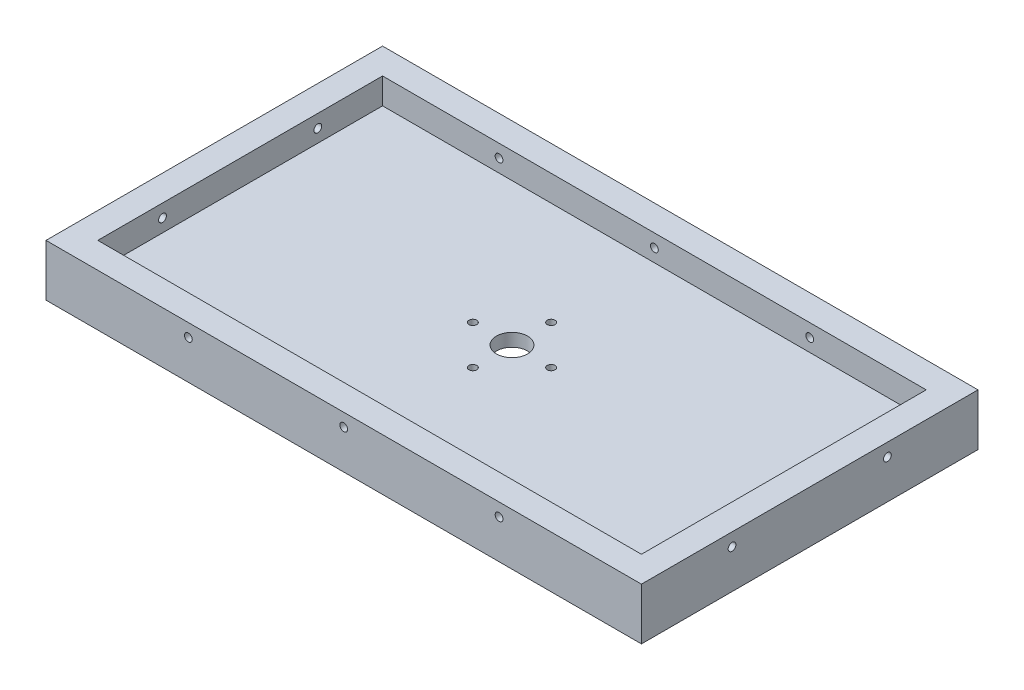
ISO-10303-21;
HEADER;
FILE_DESCRIPTION(('STEP AP214'),'2;1');
FILE_NAME('part.step','',(''),(''),'','','');
FILE_SCHEMA(('AUTOMOTIVE_DESIGN { 1 0 10303 214 1 1 1 1 }'));
ENDSEC;
DATA;
#1=APPLICATION_CONTEXT('core data for automotive mechanical design processes');
#2=APPLICATION_PROTOCOL_DEFINITION('international standard','automotive_design',2000,#1);
#3=PRODUCT_CONTEXT('',#1,'mechanical');
#4=PRODUCT('Part','Part','',(#3));
#5=PRODUCT_RELATED_PRODUCT_CATEGORY('part','',(#4));
#6=PRODUCT_DEFINITION_FORMATION('','',#4);
#7=PRODUCT_DEFINITION_CONTEXT('part definition',#1,'design');
#8=PRODUCT_DEFINITION('design','',#6,#7);
#9=PRODUCT_DEFINITION_SHAPE('','',#8);
#10=(LENGTH_UNIT() NAMED_UNIT(*) SI_UNIT(.MILLI.,.METRE.));
#11=(NAMED_UNIT(*) PLANE_ANGLE_UNIT() SI_UNIT($,.RADIAN.));
#12=(NAMED_UNIT(*) SI_UNIT($,.STERADIAN.) SOLID_ANGLE_UNIT());
#13=UNCERTAINTY_MEASURE_WITH_UNIT(LENGTH_MEASURE(1.E-05),#10,'distance_accuracy_value','');
#14=(GEOMETRIC_REPRESENTATION_CONTEXT(3) GLOBAL_UNCERTAINTY_ASSIGNED_CONTEXT((#13)) GLOBAL_UNIT_ASSIGNED_CONTEXT((#10,
#11,#12)) REPRESENTATION_CONTEXT('',''));
#15=CARTESIAN_POINT('',(0.,0.,0.));
#16=DIRECTION('',(0.,0.,1.));
#17=DIRECTION('',(1.,0.,0.));
#18=AXIS2_PLACEMENT_3D('',#15,#16,#17);
#19=CARTESIAN_POINT('',(0.,10.,0.));
#20=DIRECTION('',(0.,-1.,0.));
#21=DIRECTION('',(0.,0.,-1.));
#22=AXIS2_PLACEMENT_3D('',#19,#20,#21);
#23=PLANE('',#22);
#24=CARTESIAN_POINT('',(105.,10.,55.));
#25=DIRECTION('',(0.,-1.,0.));
#26=DIRECTION('',(0.,0.,-1.));
#27=AXIS2_PLACEMENT_3D('',#24,#25,#26);
#28=CIRCLE('',#27,6.);
#29=CARTESIAN_POINT('',(105.,10.,49.));
#30=VERTEX_POINT('',#29);
#31=EDGE_CURVE('E204',#30,#30,#28,.T.);
#32=ORIENTED_EDGE('',*,*,#31,.T.);
#33=EDGE_LOOP('',(#32));
#34=FACE_BOUND('',#33,.T.);
#35=CARTESIAN_POINT('',(120.12891571032,10.,55.));
#36=DIRECTION('',(0.,-1.,0.));
#37=DIRECTION('',(0.,0.,-1.));
#38=AXIS2_PLACEMENT_3D('',#35,#36,#37);
#39=CIRCLE('',#38,1.5);
#40=CARTESIAN_POINT('',(120.12891571032,10.,53.5));
#41=VERTEX_POINT('',#40);
#42=EDGE_CURVE('E212',#41,#41,#39,.T.);
#43=ORIENTED_EDGE('',*,*,#42,.T.);
#44=EDGE_LOOP('',(#43));
#45=FACE_BOUND('',#44,.T.);
#46=CARTESIAN_POINT('',(105.,10.,70.1289157103201));
#47=DIRECTION('',(0.,-1.,0.));
#48=DIRECTION('',(0.,0.,-1.));
#49=AXIS2_PLACEMENT_3D('',#46,#47,#48);
#50=CIRCLE('',#49,1.5);
#51=CARTESIAN_POINT('',(105.,10.,68.6289157103201));
#52=VERTEX_POINT('',#51);
#53=EDGE_CURVE('E224',#52,#52,#50,.T.);
#54=ORIENTED_EDGE('',*,*,#53,.T.);
#55=EDGE_LOOP('',(#54));
#56=FACE_BOUND('',#55,.T.);
#57=CARTESIAN_POINT('',(105.,10.,39.8710842896799));
#58=DIRECTION('',(0.,-1.,0.));
#59=DIRECTION('',(0.,0.,-1.));
#60=AXIS2_PLACEMENT_3D('',#57,#58,#59);
#61=CIRCLE('',#60,1.5);
#62=CARTESIAN_POINT('',(105.,10.,38.3710842896799));
#63=VERTEX_POINT('',#62);
#64=EDGE_CURVE('E232',#63,#63,#61,.T.);
#65=ORIENTED_EDGE('',*,*,#64,.T.);
#66=EDGE_LOOP('',(#65));
#67=FACE_BOUND('',#66,.T.);
#68=CARTESIAN_POINT('',(89.8710842896799,10.,55.));
#69=DIRECTION('',(0.,-1.,0.));
#70=DIRECTION('',(0.,0.,-1.));
#71=AXIS2_PLACEMENT_3D('',#68,#69,#70);
#72=CIRCLE('',#71,1.5);
#73=CARTESIAN_POINT('',(89.8710842896799,10.,53.5));
#74=VERTEX_POINT('',#73);
#75=EDGE_CURVE('E208',#74,#74,#72,.T.);
#76=ORIENTED_EDGE('',*,*,#75,.T.);
#77=EDGE_LOOP('',(#76));
#78=FACE_BOUND('',#77,.T.);
#79=DIRECTION('',(0.,0.,1.));
#80=VECTOR('',#79,1.);
#81=CARTESIAN_POINT('',(0.,10.,110.));
#82=LINE('',#81,#80);
#83=CARTESIAN_POINT('',(0.,10.,0.));
#84=VERTEX_POINT('',#83);
#85=CARTESIAN_POINT('',(0.,10.,110.));
#86=VERTEX_POINT('',#85);
#87=EDGE_CURVE('E112',#84,#86,#82,.T.);
#88=ORIENTED_EDGE('',*,*,#87,.T.);
#89=DIRECTION('',(1.,0.,0.));
#90=VECTOR('',#89,1.);
#91=CARTESIAN_POINT('',(210.,10.,110.));
#92=LINE('',#91,#90);
#93=CARTESIAN_POINT('',(210.,10.,110.));
#94=VERTEX_POINT('',#93);
#95=EDGE_CURVE('E65',#86,#94,#92,.T.);
#96=ORIENTED_EDGE('',*,*,#95,.T.);
#97=DIRECTION('',(0.,0.,-1.));
#98=VECTOR('',#97,1.);
#99=CARTESIAN_POINT('',(210.,10.,0.));
#100=LINE('',#99,#98);
#101=CARTESIAN_POINT('',(210.,10.,0.));
#102=VERTEX_POINT('',#101);
#103=EDGE_CURVE('E49',#94,#102,#100,.T.);
#104=ORIENTED_EDGE('',*,*,#103,.T.);
#105=DIRECTION('',(-1.,0.,0.));
#106=VECTOR('',#105,1.);
#107=CARTESIAN_POINT('',(0.,10.,0.));
#108=LINE('',#107,#106);
#109=EDGE_CURVE('E11',#102,#84,#108,.T.);
#110=ORIENTED_EDGE('',*,*,#109,.T.);
#111=EDGE_LOOP('',(#88,#96,#104,#110));
#112=FACE_BOUND('',#111,.T.);
#113=ADVANCED_FACE('F39',(#34,#45,#56,#67,#78,#112),#23,.F.);
#114=CARTESIAN_POINT('',(0.,0.,0.));
#115=DIRECTION('',(0.,-1.,0.));
#116=DIRECTION('',(0.,0.,-1.));
#117=AXIS2_PLACEMENT_3D('',#114,#115,#116);
#118=PLANE('',#117);
#119=CARTESIAN_POINT('',(105.,0.,55.));
#120=DIRECTION('',(0.,-1.,0.));
#121=DIRECTION('',(0.,0.,-1.));
#122=AXIS2_PLACEMENT_3D('',#119,#120,#121);
#123=CIRCLE('',#122,30.);
#124=CARTESIAN_POINT('',(105.,0.,25.));
#125=VERTEX_POINT('',#124);
#126=EDGE_CURVE('E187',#125,#125,#123,.T.);
#127=ORIENTED_EDGE('',*,*,#126,.F.);
#128=EDGE_LOOP('',(#127));
#129=FACE_BOUND('',#128,.T.);
#130=DIRECTION('',(-1.,0.,0.));
#131=VECTOR('',#130,1.);
#132=CARTESIAN_POINT('',(220.,0.,120.));
#133=LINE('',#132,#131);
#134=CARTESIAN_POINT('',(220.,0.,120.));
#135=VERTEX_POINT('',#134);
#136=CARTESIAN_POINT('',(-10.,0.,120.));
#137=VERTEX_POINT('',#136);
#138=EDGE_CURVE('E156',#135,#137,#133,.T.);
#139=ORIENTED_EDGE('',*,*,#138,.T.);
#140=DIRECTION('',(0.,0.,-1.));
#141=VECTOR('',#140,1.);
#142=CARTESIAN_POINT('',(-10.,0.,110.));
#143=LINE('',#142,#141);
#144=CARTESIAN_POINT('',(-10.,0.,-9.99999999999997));
#145=VERTEX_POINT('',#144);
#146=EDGE_CURVE('E146',#137,#145,#143,.T.);
#147=ORIENTED_EDGE('',*,*,#146,.T.);
#148=DIRECTION('',(1.,0.,0.));
#149=VECTOR('',#148,1.);
#150=CARTESIAN_POINT('',(-10.,0.,-9.99999999999997));
#151=LINE('',#150,#149);
#152=CARTESIAN_POINT('',(220.,0.,-9.99999999999994));
#153=VERTEX_POINT('',#152);
#154=EDGE_CURVE('E172',#145,#153,#151,.T.);
#155=ORIENTED_EDGE('',*,*,#154,.T.);
#156=DIRECTION('',(0.,0.,1.));
#157=VECTOR('',#156,1.);
#158=CARTESIAN_POINT('',(220.,0.,-9.99999999999994));
#159=LINE('',#158,#157);
#160=EDGE_CURVE('E176',#153,#135,#159,.T.);
#161=ORIENTED_EDGE('',*,*,#160,.T.);
#162=EDGE_LOOP('',(#139,#147,#155,#161));
#163=FACE_BOUND('',#162,.T.);
#164=ADVANCED_FACE('F41',(#129,#163),#118,.T.);
#165=CARTESIAN_POINT('',(0.,5.,0.));
#166=DIRECTION('',(0.,-1.,0.));
#167=DIRECTION('',(0.,0.,-1.));
#168=AXIS2_PLACEMENT_3D('',#165,#166,#167);
#169=PLANE('',#168);
#170=CARTESIAN_POINT('',(105.,5.,55.));
#171=DIRECTION('',(0.,-1.,0.));
#172=DIRECTION('',(0.,0.,-1.));
#173=AXIS2_PLACEMENT_3D('',#170,#171,#172);
#174=CIRCLE('',#173,6.);
#175=CARTESIAN_POINT('',(105.,5.,49.));
#176=VERTEX_POINT('',#175);
#177=EDGE_CURVE('E200',#176,#176,#174,.T.);
#178=ORIENTED_EDGE('',*,*,#177,.F.);
#179=EDGE_LOOP('',(#178));
#180=FACE_BOUND('',#179,.T.);
#181=CARTESIAN_POINT('',(120.12891571032,5.,55.));
#182=DIRECTION('',(0.,-1.,0.));
#183=DIRECTION('',(0.,0.,-1.));
#184=AXIS2_PLACEMENT_3D('',#181,#182,#183);
#185=CIRCLE('',#184,1.5);
#186=CARTESIAN_POINT('',(120.12891571032,5.,53.5));
#187=VERTEX_POINT('',#186);
#188=EDGE_CURVE('E216',#187,#187,#185,.T.);
#189=ORIENTED_EDGE('',*,*,#188,.F.);
#190=EDGE_LOOP('',(#189));
#191=FACE_BOUND('',#190,.T.);
#192=CARTESIAN_POINT('',(105.,5.,70.1289157103201));
#193=DIRECTION('',(0.,-1.,0.));
#194=DIRECTION('',(0.,0.,-1.));
#195=AXIS2_PLACEMENT_3D('',#192,#193,#194);
#196=CIRCLE('',#195,1.5);
#197=CARTESIAN_POINT('',(105.,5.,68.6289157103201));
#198=VERTEX_POINT('',#197);
#199=EDGE_CURVE('E220',#198,#198,#196,.T.);
#200=ORIENTED_EDGE('',*,*,#199,.F.);
#201=EDGE_LOOP('',(#200));
#202=FACE_BOUND('',#201,.T.);
#203=CARTESIAN_POINT('',(105.,5.,39.8710842896799));
#204=DIRECTION('',(0.,-1.,0.));
#205=DIRECTION('',(0.,0.,-1.));
#206=AXIS2_PLACEMENT_3D('',#203,#204,#205);
#207=CIRCLE('',#206,1.5);
#208=CARTESIAN_POINT('',(105.,5.,38.3710842896799));
#209=VERTEX_POINT('',#208);
#210=EDGE_CURVE('E228',#209,#209,#207,.T.);
#211=ORIENTED_EDGE('',*,*,#210,.F.);
#212=EDGE_LOOP('',(#211));
#213=FACE_BOUND('',#212,.T.);
#214=CARTESIAN_POINT('',(89.8710842896799,5.,55.));
#215=DIRECTION('',(0.,-1.,0.));
#216=DIRECTION('',(0.,0.,-1.));
#217=AXIS2_PLACEMENT_3D('',#214,#215,#216);
#218=CIRCLE('',#217,1.5);
#219=CARTESIAN_POINT('',(89.8710842896799,5.,53.5));
#220=VERTEX_POINT('',#219);
#221=EDGE_CURVE('E236',#220,#220,#218,.T.);
#222=ORIENTED_EDGE('',*,*,#221,.F.);
#223=EDGE_LOOP('',(#222));
#224=FACE_BOUND('',#223,.T.);
#225=CARTESIAN_POINT('',(105.,5.,55.));
#226=DIRECTION('',(0.,-1.,0.));
#227=DIRECTION('',(0.,0.,-1.));
#228=AXIS2_PLACEMENT_3D('',#225,#226,#227);
#229=CIRCLE('',#228,30.);
#230=CARTESIAN_POINT('',(105.,5.,25.));
#231=VERTEX_POINT('',#230);
#232=EDGE_CURVE('E196',#231,#231,#229,.T.);
#233=ORIENTED_EDGE('',*,*,#232,.T.);
#234=EDGE_LOOP('',(#233));
#235=FACE_BOUND('',#234,.T.);
#236=ADVANCED_FACE('F342',(#180,#191,#202,#213,#224,#235),#169,.T.);
#237=CARTESIAN_POINT('',(89.8710842896799,10.,55.));
#238=DIRECTION('',(0.,-1.,0.));
#239=DIRECTION('',(0.,0.,-1.));
#240=AXIS2_PLACEMENT_3D('',#237,#238,#239);
#241=CYLINDRICAL_SURFACE('',#240,1.5);
#242=ORIENTED_EDGE('',*,*,#75,.F.);
#243=EDGE_LOOP('',(#242));
#244=FACE_BOUND('',#243,.T.);
#245=ORIENTED_EDGE('',*,*,#221,.T.);
#246=EDGE_LOOP('',(#245));
#247=FACE_BOUND('',#246,.T.);
#248=ADVANCED_FACE('F348',(#244,#247),#241,.F.);
#249=CARTESIAN_POINT('',(105.,10.,39.8710842896799));
#250=DIRECTION('',(0.,-1.,0.));
#251=DIRECTION('',(0.,0.,-1.));
#252=AXIS2_PLACEMENT_3D('',#249,#250,#251);
#253=CYLINDRICAL_SURFACE('',#252,1.5);
#254=ORIENTED_EDGE('',*,*,#64,.F.);
#255=EDGE_LOOP('',(#254));
#256=FACE_BOUND('',#255,.T.);
#257=ORIENTED_EDGE('',*,*,#210,.T.);
#258=EDGE_LOOP('',(#257));
#259=FACE_BOUND('',#258,.T.);
#260=ADVANCED_FACE('F352',(#256,#259),#253,.F.);
#261=CARTESIAN_POINT('',(105.,10.,70.1289157103201));
#262=DIRECTION('',(0.,-1.,0.));
#263=DIRECTION('',(0.,0.,-1.));
#264=AXIS2_PLACEMENT_3D('',#261,#262,#263);
#265=CYLINDRICAL_SURFACE('',#264,1.5);
#266=ORIENTED_EDGE('',*,*,#53,.F.);
#267=EDGE_LOOP('',(#266));
#268=FACE_BOUND('',#267,.T.);
#269=ORIENTED_EDGE('',*,*,#199,.T.);
#270=EDGE_LOOP('',(#269));
#271=FACE_BOUND('',#270,.T.);
#272=ADVANCED_FACE('F356',(#268,#271),#265,.F.);
#273=CARTESIAN_POINT('',(120.12891571032,10.,55.));
#274=DIRECTION('',(0.,-1.,0.));
#275=DIRECTION('',(0.,0.,-1.));
#276=AXIS2_PLACEMENT_3D('',#273,#274,#275);
#277=CYLINDRICAL_SURFACE('',#276,1.5);
#278=ORIENTED_EDGE('',*,*,#42,.F.);
#279=EDGE_LOOP('',(#278));
#280=FACE_BOUND('',#279,.T.);
#281=ORIENTED_EDGE('',*,*,#188,.T.);
#282=EDGE_LOOP('',(#281));
#283=FACE_BOUND('',#282,.T.);
#284=ADVANCED_FACE('F360',(#280,#283),#277,.F.);
#285=CARTESIAN_POINT('',(105.,10.,55.));
#286=DIRECTION('',(0.,-1.,0.));
#287=DIRECTION('',(0.,0.,-1.));
#288=AXIS2_PLACEMENT_3D('',#285,#286,#287);
#289=CYLINDRICAL_SURFACE('',#288,6.);
#290=ORIENTED_EDGE('',*,*,#31,.F.);
#291=EDGE_LOOP('',(#290));
#292=FACE_BOUND('',#291,.T.);
#293=ORIENTED_EDGE('',*,*,#177,.T.);
#294=EDGE_LOOP('',(#293));
#295=FACE_BOUND('',#294,.T.);
#296=ADVANCED_FACE('F364',(#292,#295),#289,.F.);
#297=CARTESIAN_POINT('',(105.,5.,55.));
#298=DIRECTION('',(0.,-1.,0.));
#299=DIRECTION('',(0.,0.,-1.));
#300=AXIS2_PLACEMENT_3D('',#297,#298,#299);
#301=CYLINDRICAL_SURFACE('',#300,30.);
#302=ORIENTED_EDGE('',*,*,#232,.F.);
#303=EDGE_LOOP('',(#302));
#304=FACE_BOUND('',#303,.T.);
#305=ORIENTED_EDGE('',*,*,#126,.T.);
#306=EDGE_LOOP('',(#305));
#307=FACE_BOUND('',#306,.T.);
#308=ADVANCED_FACE('F368',(#304,#307),#301,.F.);
#309=CARTESIAN_POINT('',(0.,20.,0.));
#310=DIRECTION('',(-1.,0.,0.));
#311=DIRECTION('',(0.,0.,1.));
#312=AXIS2_PLACEMENT_3D('',#309,#310,#311);
#313=PLANE('',#312);
#314=CARTESIAN_POINT('',(0.,15.,25.));
#315=DIRECTION('',(-1.,0.,0.));
#316=DIRECTION('',(0.,0.,1.));
#317=AXIS2_PLACEMENT_3D('',#314,#315,#316);
#318=CIRCLE('',#317,1.5);
#319=CARTESIAN_POINT('',(0.,15.,26.5));
#320=VERTEX_POINT('',#319);
#321=EDGE_CURVE('E131',#320,#320,#318,.T.);
#322=ORIENTED_EDGE('',*,*,#321,.T.);
#323=EDGE_LOOP('',(#322));
#324=FACE_BOUND('',#323,.T.);
#325=CARTESIAN_POINT('',(0.,15.,85.));
#326=DIRECTION('',(-1.,0.,0.));
#327=DIRECTION('',(0.,0.,1.));
#328=AXIS2_PLACEMENT_3D('',#325,#326,#327);
#329=CIRCLE('',#328,1.5);
#330=CARTESIAN_POINT('',(0.,15.,86.5));
#331=VERTEX_POINT('',#330);
#332=EDGE_CURVE('E303',#331,#331,#329,.T.);
#333=ORIENTED_EDGE('',*,*,#332,.T.);
#334=EDGE_LOOP('',(#333));
#335=FACE_BOUND('',#334,.T.);
#336=DIRECTION('',(0.,-1.,0.));
#337=VECTOR('',#336,1.);
#338=CARTESIAN_POINT('',(0.,20.,110.));
#339=LINE('',#338,#337);
#340=CARTESIAN_POINT('',(0.,20.,110.));
#341=VERTEX_POINT('',#340);
#342=EDGE_CURVE('E143',#341,#86,#339,.T.);
#343=ORIENTED_EDGE('',*,*,#342,.T.);
#344=ORIENTED_EDGE('',*,*,#87,.F.);
#345=DIRECTION('',(0.,-1.,0.));
#346=VECTOR('',#345,1.);
#347=CARTESIAN_POINT('',(0.,20.,0.));
#348=LINE('',#347,#346);
#349=CARTESIAN_POINT('',(0.,20.,0.));
#350=VERTEX_POINT('',#349);
#351=EDGE_CURVE('E57',#350,#84,#348,.T.);
#352=ORIENTED_EDGE('',*,*,#351,.F.);
#353=DIRECTION('',(0.,0.,-1.));
#354=VECTOR('',#353,1.);
#355=CARTESIAN_POINT('',(0.,20.,0.));
#356=LINE('',#355,#354);
#357=EDGE_CURVE('E109',#341,#350,#356,.T.);
#358=ORIENTED_EDGE('',*,*,#357,.F.);
#359=EDGE_LOOP('',(#343,#344,#352,#358));
#360=FACE_BOUND('',#359,.T.);
#361=ADVANCED_FACE('F107',(#324,#335,#360),#313,.F.);
#362=CARTESIAN_POINT('',(0.,20.,110.));
#363=DIRECTION('',(0.,0.,1.));
#364=DIRECTION('',(1.,0.,0.));
#365=AXIS2_PLACEMENT_3D('',#362,#363,#364);
#366=PLANE('',#365);
#367=CARTESIAN_POINT('',(45.,15.,110.));
#368=DIRECTION('',(0.,0.,1.));
#369=DIRECTION('',(1.,0.,0.));
#370=AXIS2_PLACEMENT_3D('',#367,#368,#369);
#371=CIRCLE('',#370,1.5);
#372=CARTESIAN_POINT('',(46.5,15.,110.));
#373=VERTEX_POINT('',#372);
#374=EDGE_CURVE('E283',#373,#373,#371,.T.);
#375=ORIENTED_EDGE('',*,*,#374,.T.);
#376=EDGE_LOOP('',(#375));
#377=FACE_BOUND('',#376,.T.);
#378=CARTESIAN_POINT('',(105.,15.,110.));
#379=DIRECTION('',(0.,0.,1.));
#380=DIRECTION('',(1.,0.,0.));
#381=AXIS2_PLACEMENT_3D('',#378,#379,#380);
#382=CIRCLE('',#381,1.5);
#383=CARTESIAN_POINT('',(106.5,15.,110.));
#384=VERTEX_POINT('',#383);
#385=EDGE_CURVE('E265',#384,#384,#382,.T.);
#386=ORIENTED_EDGE('',*,*,#385,.T.);
#387=EDGE_LOOP('',(#386));
#388=FACE_BOUND('',#387,.T.);
#389=CARTESIAN_POINT('',(165.,15.,110.));
#390=DIRECTION('',(0.,0.,1.));
#391=DIRECTION('',(1.,0.,0.));
#392=AXIS2_PLACEMENT_3D('',#389,#390,#391);
#393=CIRCLE('',#392,1.5);
#394=CARTESIAN_POINT('',(166.5,15.,110.));
#395=VERTEX_POINT('',#394);
#396=EDGE_CURVE('E259',#395,#395,#393,.T.);
#397=ORIENTED_EDGE('',*,*,#396,.T.);
#398=EDGE_LOOP('',(#397));
#399=FACE_BOUND('',#398,.T.);
#400=DIRECTION('',(0.,-1.,0.));
#401=VECTOR('',#400,1.);
#402=CARTESIAN_POINT('',(210.,20.,110.));
#403=LINE('',#402,#401);
#404=CARTESIAN_POINT('',(210.,20.,110.));
#405=VERTEX_POINT('',#404);
#406=EDGE_CURVE('E147',#405,#94,#403,.T.);
#407=ORIENTED_EDGE('',*,*,#406,.T.);
#408=ORIENTED_EDGE('',*,*,#95,.F.);
#409=ORIENTED_EDGE('',*,*,#342,.F.);
#410=DIRECTION('',(-1.,0.,0.));
#411=VECTOR('',#410,1.);
#412=CARTESIAN_POINT('',(0.,20.,110.));
#413=LINE('',#412,#411);
#414=EDGE_CURVE('E115',#405,#341,#413,.T.);
#415=ORIENTED_EDGE('',*,*,#414,.F.);
#416=EDGE_LOOP('',(#407,#408,#409,#415));
#417=FACE_BOUND('',#416,.T.);
#418=ADVANCED_FACE('F393',(#377,#388,#399,#417),#366,.F.);
#419=CARTESIAN_POINT('',(210.,20.,110.));
#420=DIRECTION('',(1.,0.,0.));
#421=DIRECTION('',(0.,0.,-1.));
#422=AXIS2_PLACEMENT_3D('',#419,#420,#421);
#423=PLANE('',#422);
#424=CARTESIAN_POINT('',(210.,15.,25.));
#425=DIRECTION('',(1.,0.,0.));
#426=DIRECTION('',(0.,0.,-1.));
#427=AXIS2_PLACEMENT_3D('',#424,#425,#426);
#428=CIRCLE('',#427,1.5);
#429=CARTESIAN_POINT('',(210.,15.,23.5));
#430=VERTEX_POINT('',#429);
#431=EDGE_CURVE('E135',#430,#430,#428,.T.);
#432=ORIENTED_EDGE('',*,*,#431,.T.);
#433=EDGE_LOOP('',(#432));
#434=FACE_BOUND('',#433,.T.);
#435=CARTESIAN_POINT('',(210.,15.,85.));
#436=DIRECTION('',(1.,0.,0.));
#437=DIRECTION('',(0.,0.,-1.));
#438=AXIS2_PLACEMENT_3D('',#435,#436,#437);
#439=CIRCLE('',#438,1.5);
#440=CARTESIAN_POINT('',(210.,15.,83.5));
#441=VERTEX_POINT('',#440);
#442=EDGE_CURVE('E299',#441,#441,#439,.T.);
#443=ORIENTED_EDGE('',*,*,#442,.T.);
#444=EDGE_LOOP('',(#443));
#445=FACE_BOUND('',#444,.T.);
#446=DIRECTION('',(0.,-1.,0.));
#447=VECTOR('',#446,1.);
#448=CARTESIAN_POINT('',(210.,20.,0.));
#449=LINE('',#448,#447);
#450=CARTESIAN_POINT('',(210.,20.,0.));
#451=VERTEX_POINT('',#450);
#452=EDGE_CURVE('E114',#451,#102,#449,.T.);
#453=ORIENTED_EDGE('',*,*,#452,.T.);
#454=ORIENTED_EDGE('',*,*,#103,.F.);
#455=ORIENTED_EDGE('',*,*,#406,.F.);
#456=DIRECTION('',(0.,0.,1.));
#457=VECTOR('',#456,1.);
#458=CARTESIAN_POINT('',(210.,20.,110.));
#459=LINE('',#458,#457);
#460=EDGE_CURVE('E125',#451,#405,#459,.T.);
#461=ORIENTED_EDGE('',*,*,#460,.F.);
#462=EDGE_LOOP('',(#453,#454,#455,#461));
#463=FACE_BOUND('',#462,.T.);
#464=ADVANCED_FACE('F314',(#434,#445,#463),#423,.F.);
#465=CARTESIAN_POINT('',(210.,20.,0.));
#466=DIRECTION('',(0.,0.,-1.));
#467=DIRECTION('',(-1.,0.,0.));
#468=AXIS2_PLACEMENT_3D('',#465,#466,#467);
#469=PLANE('',#468);
#470=CARTESIAN_POINT('',(45.,15.,0.));
#471=DIRECTION('',(0.,0.,-1.));
#472=DIRECTION('',(-1.,0.,0.));
#473=AXIS2_PLACEMENT_3D('',#470,#471,#472);
#474=CIRCLE('',#473,1.5);
#475=CARTESIAN_POINT('',(43.5,15.,0.));
#476=VERTEX_POINT('',#475);
#477=EDGE_CURVE('E279',#476,#476,#474,.T.);
#478=ORIENTED_EDGE('',*,*,#477,.T.);
#479=EDGE_LOOP('',(#478));
#480=FACE_BOUND('',#479,.T.);
#481=CARTESIAN_POINT('',(105.,15.,0.));
#482=DIRECTION('',(0.,0.,-1.));
#483=DIRECTION('',(-1.,0.,0.));
#484=AXIS2_PLACEMENT_3D('',#481,#482,#483);
#485=CIRCLE('',#484,1.5);
#486=CARTESIAN_POINT('',(103.5,15.,0.));
#487=VERTEX_POINT('',#486);
#488=EDGE_CURVE('E258',#487,#487,#485,.T.);
#489=ORIENTED_EDGE('',*,*,#488,.T.);
#490=EDGE_LOOP('',(#489));
#491=FACE_BOUND('',#490,.T.);
#492=CARTESIAN_POINT('',(165.,15.,0.));
#493=DIRECTION('',(0.,0.,-1.));
#494=DIRECTION('',(-1.,0.,0.));
#495=AXIS2_PLACEMENT_3D('',#492,#493,#494);
#496=CIRCLE('',#495,1.5);
#497=CARTESIAN_POINT('',(163.5,15.,0.));
#498=VERTEX_POINT('',#497);
#499=EDGE_CURVE('E253',#498,#498,#496,.T.);
#500=ORIENTED_EDGE('',*,*,#499,.T.);
#501=EDGE_LOOP('',(#500));
#502=FACE_BOUND('',#501,.T.);
#503=ORIENTED_EDGE('',*,*,#351,.T.);
#504=ORIENTED_EDGE('',*,*,#109,.F.);
#505=ORIENTED_EDGE('',*,*,#452,.F.);
#506=DIRECTION('',(1.,0.,0.));
#507=VECTOR('',#506,1.);
#508=CARTESIAN_POINT('',(210.,20.,0.));
#509=LINE('',#508,#507);
#510=EDGE_CURVE('E119',#350,#451,#509,.T.);
#511=ORIENTED_EDGE('',*,*,#510,.F.);
#512=EDGE_LOOP('',(#503,#504,#505,#511));
#513=FACE_BOUND('',#512,.T.);
#514=ADVANCED_FACE('F120',(#480,#491,#502,#513),#469,.F.);
#515=CARTESIAN_POINT('',(220.,20.,120.));
#516=DIRECTION('',(0.,0.,1.));
#517=DIRECTION('',(1.,0.,0.));
#518=AXIS2_PLACEMENT_3D('',#515,#516,#517);
#519=PLANE('',#518);
#520=CARTESIAN_POINT('',(45.,15.,120.));
#521=DIRECTION('',(0.,0.,1.));
#522=DIRECTION('',(1.,0.,0.));
#523=AXIS2_PLACEMENT_3D('',#520,#521,#522);
#524=CIRCLE('',#523,1.5);
#525=CARTESIAN_POINT('',(46.5,15.,120.));
#526=VERTEX_POINT('',#525);
#527=EDGE_CURVE('E254',#526,#526,#524,.T.);
#528=ORIENTED_EDGE('',*,*,#527,.F.);
#529=EDGE_LOOP('',(#528));
#530=FACE_BOUND('',#529,.T.);
#531=CARTESIAN_POINT('',(105.,15.,120.));
#532=DIRECTION('',(0.,0.,1.));
#533=DIRECTION('',(1.,0.,0.));
#534=AXIS2_PLACEMENT_3D('',#531,#532,#533);
#535=CIRCLE('',#534,1.5);
#536=CARTESIAN_POINT('',(106.5,15.,120.));
#537=VERTEX_POINT('',#536);
#538=EDGE_CURVE('E531',#537,#537,#535,.T.);
#539=ORIENTED_EDGE('',*,*,#538,.F.);
#540=EDGE_LOOP('',(#539));
#541=FACE_BOUND('',#540,.T.);
#542=CARTESIAN_POINT('',(165.,15.,120.));
#543=DIRECTION('',(0.,0.,1.));
#544=DIRECTION('',(1.,0.,0.));
#545=AXIS2_PLACEMENT_3D('',#542,#543,#544);
#546=CIRCLE('',#545,1.5);
#547=CARTESIAN_POINT('',(166.5,15.,120.));
#548=VERTEX_POINT('',#547);
#549=EDGE_CURVE('E535',#548,#548,#546,.T.);
#550=ORIENTED_EDGE('',*,*,#549,.F.);
#551=EDGE_LOOP('',(#550));
#552=FACE_BOUND('',#551,.T.);
#553=ORIENTED_EDGE('',*,*,#138,.F.);
#554=DIRECTION('',(0.,-1.,0.));
#555=VECTOR('',#554,1.);
#556=CARTESIAN_POINT('',(220.,20.,120.));
#557=LINE('',#556,#555);
#558=CARTESIAN_POINT('',(220.,20.,120.));
#559=VERTEX_POINT('',#558);
#560=EDGE_CURVE('E188',#559,#135,#557,.T.);
#561=ORIENTED_EDGE('',*,*,#560,.F.);
#562=DIRECTION('',(-1.,0.,0.));
#563=VECTOR('',#562,1.);
#564=CARTESIAN_POINT('',(220.,20.,120.));
#565=LINE('',#564,#563);
#566=CARTESIAN_POINT('',(-10.,20.,120.));
#567=VERTEX_POINT('',#566);
#568=EDGE_CURVE('E164',#559,#567,#565,.T.);
#569=ORIENTED_EDGE('',*,*,#568,.T.);
#570=DIRECTION('',(0.,-1.,0.));
#571=VECTOR('',#570,1.);
#572=CARTESIAN_POINT('',(-10.,20.,120.));
#573=LINE('',#572,#571);
#574=EDGE_CURVE('E183',#567,#137,#573,.T.);
#575=ORIENTED_EDGE('',*,*,#574,.T.);
#576=EDGE_LOOP('',(#553,#561,#569,#575));
#577=FACE_BOUND('',#576,.T.);
#578=ADVANCED_FACE('F384',(#530,#541,#552,#577),#519,.T.);
#579=CARTESIAN_POINT('',(220.,20.,-9.99999999999994));
#580=DIRECTION('',(1.,0.,0.));
#581=DIRECTION('',(0.,0.,-1.));
#582=AXIS2_PLACEMENT_3D('',#579,#580,#581);
#583=PLANE('',#582);
#584=CARTESIAN_POINT('',(220.,15.,25.));
#585=DIRECTION('',(1.,0.,0.));
#586=DIRECTION('',(0.,0.,-1.));
#587=AXIS2_PLACEMENT_3D('',#584,#585,#586);
#588=CIRCLE('',#587,1.5);
#589=CARTESIAN_POINT('',(220.,15.,23.5));
#590=VERTEX_POINT('',#589);
#591=EDGE_CURVE('E307',#590,#590,#588,.T.);
#592=ORIENTED_EDGE('',*,*,#591,.F.);
#593=EDGE_LOOP('',(#592));
#594=FACE_BOUND('',#593,.T.);
#595=CARTESIAN_POINT('',(220.,15.,85.));
#596=DIRECTION('',(1.,0.,0.));
#597=DIRECTION('',(0.,0.,-1.));
#598=AXIS2_PLACEMENT_3D('',#595,#596,#597);
#599=CIRCLE('',#598,1.5);
#600=CARTESIAN_POINT('',(220.,15.,83.5));
#601=VERTEX_POINT('',#600);
#602=EDGE_CURVE('E292',#601,#601,#599,.T.);
#603=ORIENTED_EDGE('',*,*,#602,.F.);
#604=EDGE_LOOP('',(#603));
#605=FACE_BOUND('',#604,.T.);
#606=ORIENTED_EDGE('',*,*,#160,.F.);
#607=DIRECTION('',(0.,-1.,0.));
#608=VECTOR('',#607,1.);
#609=CARTESIAN_POINT('',(220.,20.,-9.99999999999994));
#610=LINE('',#609,#608);
#611=CARTESIAN_POINT('',(220.,20.,-9.99999999999994));
#612=VERTEX_POINT('',#611);
#613=EDGE_CURVE('E191',#612,#153,#610,.T.);
#614=ORIENTED_EDGE('',*,*,#613,.F.);
#615=DIRECTION('',(0.,0.,1.));
#616=VECTOR('',#615,1.);
#617=CARTESIAN_POINT('',(220.,20.,-9.99999999999994));
#618=LINE('',#617,#616);
#619=EDGE_CURVE('E160',#612,#559,#618,.T.);
#620=ORIENTED_EDGE('',*,*,#619,.T.);
#621=ORIENTED_EDGE('',*,*,#560,.T.);
#622=EDGE_LOOP('',(#606,#614,#620,#621));
#623=FACE_BOUND('',#622,.T.);
#624=ADVANCED_FACE('F380',(#594,#605,#623),#583,.T.);
#625=CARTESIAN_POINT('',(-10.,20.,-9.99999999999997));
#626=DIRECTION('',(0.,0.,-1.));
#627=DIRECTION('',(-1.,0.,0.));
#628=AXIS2_PLACEMENT_3D('',#625,#626,#627);
#629=PLANE('',#628);
#630=CARTESIAN_POINT('',(45.,15.,-9.99999999999995));
#631=DIRECTION('',(0.,0.,-1.));
#632=DIRECTION('',(-1.,0.,0.));
#633=AXIS2_PLACEMENT_3D('',#630,#631,#632);
#634=CIRCLE('',#633,1.5);
#635=CARTESIAN_POINT('',(43.5,15.,-9.99999999999995));
#636=VERTEX_POINT('',#635);
#637=EDGE_CURVE('E43',#636,#636,#634,.T.);
#638=ORIENTED_EDGE('',*,*,#637,.F.);
#639=EDGE_LOOP('',(#638));
#640=FACE_BOUND('',#639,.T.);
#641=CARTESIAN_POINT('',(105.,15.,-9.99999999999995));
#642=DIRECTION('',(0.,0.,-1.));
#643=DIRECTION('',(-1.,0.,0.));
#644=AXIS2_PLACEMENT_3D('',#641,#642,#643);
#645=CIRCLE('',#644,1.5);
#646=CARTESIAN_POINT('',(103.5,15.,-9.99999999999995));
#647=VERTEX_POINT('',#646);
#648=EDGE_CURVE('E255',#647,#647,#645,.T.);
#649=ORIENTED_EDGE('',*,*,#648,.F.);
#650=EDGE_LOOP('',(#649));
#651=FACE_BOUND('',#650,.T.);
#652=CARTESIAN_POINT('',(165.,15.,-9.99999999999993));
#653=DIRECTION('',(0.,0.,-1.));
#654=DIRECTION('',(-1.,0.,0.));
#655=AXIS2_PLACEMENT_3D('',#652,#653,#654);
#656=CIRCLE('',#655,1.5);
#657=CARTESIAN_POINT('',(163.5,15.,-9.99999999999993));
#658=VERTEX_POINT('',#657);
#659=EDGE_CURVE('E250',#658,#658,#656,.T.);
#660=ORIENTED_EDGE('',*,*,#659,.F.);
#661=EDGE_LOOP('',(#660));
#662=FACE_BOUND('',#661,.T.);
#663=ORIENTED_EDGE('',*,*,#154,.F.);
#664=DIRECTION('',(0.,-1.,0.));
#665=VECTOR('',#664,1.);
#666=CARTESIAN_POINT('',(-10.,20.,-9.99999999999997));
#667=LINE('',#666,#665);
#668=CARTESIAN_POINT('',(-10.,20.,-9.99999999999997));
#669=VERTEX_POINT('',#668);
#670=EDGE_CURVE('E168',#669,#145,#667,.T.);
#671=ORIENTED_EDGE('',*,*,#670,.F.);
#672=DIRECTION('',(1.,0.,0.));
#673=VECTOR('',#672,1.);
#674=CARTESIAN_POINT('',(-10.,20.,-9.99999999999997));
#675=LINE('',#674,#673);
#676=EDGE_CURVE('E155',#669,#612,#675,.T.);
#677=ORIENTED_EDGE('',*,*,#676,.T.);
#678=ORIENTED_EDGE('',*,*,#613,.T.);
#679=EDGE_LOOP('',(#663,#671,#677,#678));
#680=FACE_BOUND('',#679,.T.);
#681=ADVANCED_FACE('F376',(#640,#651,#662,#680),#629,.T.);
#682=CARTESIAN_POINT('',(-10.,20.,110.));
#683=DIRECTION('',(-1.,0.,0.));
#684=DIRECTION('',(0.,0.,1.));
#685=AXIS2_PLACEMENT_3D('',#682,#683,#684);
#686=PLANE('',#685);
#687=CARTESIAN_POINT('',(-10.,15.,25.));
#688=DIRECTION('',(-1.,0.,0.));
#689=DIRECTION('',(0.,0.,1.));
#690=AXIS2_PLACEMENT_3D('',#687,#688,#689);
#691=CIRCLE('',#690,1.5);
#692=CARTESIAN_POINT('',(-10.,15.,26.5));
#693=VERTEX_POINT('',#692);
#694=EDGE_CURVE('E288',#693,#693,#691,.T.);
#695=ORIENTED_EDGE('',*,*,#694,.F.);
#696=EDGE_LOOP('',(#695));
#697=FACE_BOUND('',#696,.T.);
#698=CARTESIAN_POINT('',(-10.,15.,85.));
#699=DIRECTION('',(-1.,0.,0.));
#700=DIRECTION('',(0.,0.,1.));
#701=AXIS2_PLACEMENT_3D('',#698,#699,#700);
#702=CIRCLE('',#701,1.5);
#703=CARTESIAN_POINT('',(-10.,15.,86.5));
#704=VERTEX_POINT('',#703);
#705=EDGE_CURVE('E287',#704,#704,#702,.T.);
#706=ORIENTED_EDGE('',*,*,#705,.F.);
#707=EDGE_LOOP('',(#706));
#708=FACE_BOUND('',#707,.T.);
#709=ORIENTED_EDGE('',*,*,#146,.F.);
#710=ORIENTED_EDGE('',*,*,#574,.F.);
#711=DIRECTION('',(0.,0.,-1.));
#712=VECTOR('',#711,1.);
#713=CARTESIAN_POINT('',(-10.,20.,120.));
#714=LINE('',#713,#712);
#715=EDGE_CURVE('E152',#567,#669,#714,.T.);
#716=ORIENTED_EDGE('',*,*,#715,.T.);
#717=ORIENTED_EDGE('',*,*,#670,.T.);
#718=EDGE_LOOP('',(#709,#710,#716,#717));
#719=FACE_BOUND('',#718,.T.);
#720=ADVANCED_FACE('F373',(#697,#708,#719),#686,.T.);
#721=CARTESIAN_POINT('',(0.,20.,0.));
#722=DIRECTION('',(0.,-1.,0.));
#723=DIRECTION('',(0.,0.,-1.));
#724=AXIS2_PLACEMENT_3D('',#721,#722,#723);
#725=PLANE('',#724);
#726=ORIENTED_EDGE('',*,*,#414,.T.);
#727=ORIENTED_EDGE('',*,*,#357,.T.);
#728=ORIENTED_EDGE('',*,*,#510,.T.);
#729=ORIENTED_EDGE('',*,*,#460,.T.);
#730=EDGE_LOOP('',(#726,#727,#728,#729));
#731=FACE_BOUND('',#730,.T.);
#732=ORIENTED_EDGE('',*,*,#715,.F.);
#733=ORIENTED_EDGE('',*,*,#568,.F.);
#734=ORIENTED_EDGE('',*,*,#619,.F.);
#735=ORIENTED_EDGE('',*,*,#676,.F.);
#736=EDGE_LOOP('',(#732,#733,#734,#735));
#737=FACE_BOUND('',#736,.T.);
#738=ADVANCED_FACE('F127',(#731,#737),#725,.F.);
#739=CARTESIAN_POINT('',(290.,15.,85.));
#740=DIRECTION('',(-1.,0.,0.));
#741=DIRECTION('',(0.,0.,1.));
#742=AXIS2_PLACEMENT_3D('',#739,#740,#741);
#743=CYLINDRICAL_SURFACE('',#742,1.5);
#744=ORIENTED_EDGE('',*,*,#705,.T.);
#745=EDGE_LOOP('',(#744));
#746=FACE_BOUND('',#745,.T.);
#747=ORIENTED_EDGE('',*,*,#332,.F.);
#748=EDGE_LOOP('',(#747));
#749=FACE_BOUND('',#748,.T.);
#750=ADVANCED_FACE('F334',(#746,#749),#743,.F.);
#751=CARTESIAN_POINT('',(290.,15.,25.));
#752=DIRECTION('',(-1.,0.,0.));
#753=DIRECTION('',(0.,0.,1.));
#754=AXIS2_PLACEMENT_3D('',#751,#752,#753);
#755=CYLINDRICAL_SURFACE('',#754,1.5);
#756=ORIENTED_EDGE('',*,*,#694,.T.);
#757=EDGE_LOOP('',(#756));
#758=FACE_BOUND('',#757,.T.);
#759=ORIENTED_EDGE('',*,*,#321,.F.);
#760=EDGE_LOOP('',(#759));
#761=FACE_BOUND('',#760,.T.);
#762=ADVANCED_FACE('F323',(#758,#761),#755,.F.);
#763=ORIENTED_EDGE('',*,*,#602,.T.);
#764=EDGE_LOOP('',(#763));
#765=FACE_BOUND('',#764,.T.);
#766=ORIENTED_EDGE('',*,*,#442,.F.);
#767=EDGE_LOOP('',(#766));
#768=FACE_BOUND('',#767,.T.);
#769=ADVANCED_FACE('F320',(#765,#768),#743,.F.);
#770=ORIENTED_EDGE('',*,*,#591,.T.);
#771=EDGE_LOOP('',(#770));
#772=FACE_BOUND('',#771,.T.);
#773=ORIENTED_EDGE('',*,*,#431,.F.);
#774=EDGE_LOOP('',(#773));
#775=FACE_BOUND('',#774,.T.);
#776=ADVANCED_FACE('F317',(#772,#775),#755,.F.);
#777=CARTESIAN_POINT('',(165.,15.,-180.));
#778=DIRECTION('',(0.,0.,1.));
#779=DIRECTION('',(1.,0.,0.));
#780=AXIS2_PLACEMENT_3D('',#777,#778,#779);
#781=CYLINDRICAL_SURFACE('',#780,1.5);
#782=ORIENTED_EDGE('',*,*,#659,.T.);
#783=EDGE_LOOP('',(#782));
#784=FACE_BOUND('',#783,.T.);
#785=ORIENTED_EDGE('',*,*,#499,.F.);
#786=EDGE_LOOP('',(#785));
#787=FACE_BOUND('',#786,.T.);
#788=ADVANCED_FACE('F319',(#784,#787),#781,.F.);
#789=CARTESIAN_POINT('',(105.,15.,-180.));
#790=DIRECTION('',(0.,0.,1.));
#791=DIRECTION('',(1.,0.,0.));
#792=AXIS2_PLACEMENT_3D('',#789,#790,#791);
#793=CYLINDRICAL_SURFACE('',#792,1.5);
#794=ORIENTED_EDGE('',*,*,#648,.T.);
#795=EDGE_LOOP('',(#794));
#796=FACE_BOUND('',#795,.T.);
#797=ORIENTED_EDGE('',*,*,#488,.F.);
#798=EDGE_LOOP('',(#797));
#799=FACE_BOUND('',#798,.T.);
#800=ADVANCED_FACE('F328',(#796,#799),#793,.F.);
#801=CARTESIAN_POINT('',(45.,15.,-180.));
#802=DIRECTION('',(0.,0.,1.));
#803=DIRECTION('',(1.,0.,0.));
#804=AXIS2_PLACEMENT_3D('',#801,#802,#803);
#805=CYLINDRICAL_SURFACE('',#804,1.5);
#806=ORIENTED_EDGE('',*,*,#637,.T.);
#807=EDGE_LOOP('',(#806));
#808=FACE_BOUND('',#807,.T.);
#809=ORIENTED_EDGE('',*,*,#477,.F.);
#810=EDGE_LOOP('',(#809));
#811=FACE_BOUND('',#810,.T.);
#812=ADVANCED_FACE('F482',(#808,#811),#805,.F.);
#813=ORIENTED_EDGE('',*,*,#549,.T.);
#814=EDGE_LOOP('',(#813));
#815=FACE_BOUND('',#814,.T.);
#816=ORIENTED_EDGE('',*,*,#396,.F.);
#817=EDGE_LOOP('',(#816));
#818=FACE_BOUND('',#817,.T.);
#819=ADVANCED_FACE('F331',(#815,#818),#781,.F.);
#820=ORIENTED_EDGE('',*,*,#538,.T.);
#821=EDGE_LOOP('',(#820));
#822=FACE_BOUND('',#821,.T.);
#823=ORIENTED_EDGE('',*,*,#385,.F.);
#824=EDGE_LOOP('',(#823));
#825=FACE_BOUND('',#824,.T.);
#826=ADVANCED_FACE('F484',(#822,#825),#793,.F.);
#827=ORIENTED_EDGE('',*,*,#527,.T.);
#828=EDGE_LOOP('',(#827));
#829=FACE_BOUND('',#828,.T.);
#830=ORIENTED_EDGE('',*,*,#374,.F.);
#831=EDGE_LOOP('',(#830));
#832=FACE_BOUND('',#831,.T.);
#833=ADVANCED_FACE('F494',(#829,#832),#805,.F.);
#834=CLOSED_SHELL('',(#113,#164,#236,#248,#260,#272,#284,#296,#308,#361,#418,#464,#514,#578,
#624,#681,#720,#738,#750,#762,#769,#776,#788,#800,#812,#819,#826,#833));
#835=MANIFOLD_SOLID_BREP('B2',#834);
#836=ADVANCED_BREP_SHAPE_REPRESENTATION('',(#18,#835),#14);
#837=SHAPE_DEFINITION_REPRESENTATION(#9,#836);
ENDSEC;
END-ISO-10303-21;
